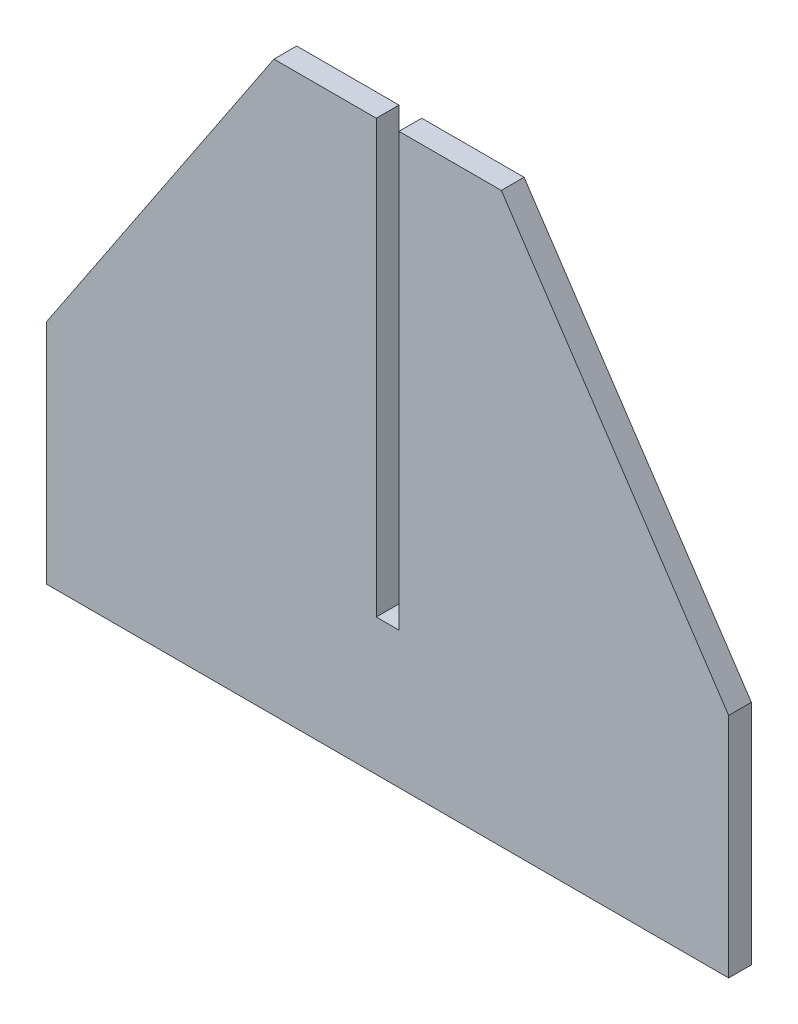
ISO-10303-21;
HEADER;
FILE_DESCRIPTION(('STEP AP214'),'2;1');
FILE_NAME('part.step','',(''),(''),'','','');
FILE_SCHEMA(('AUTOMOTIVE_DESIGN { 1 0 10303 214 1 1 1 1 }'));
ENDSEC;
DATA;
#1=APPLICATION_CONTEXT('core data for automotive mechanical design processes');
#2=APPLICATION_PROTOCOL_DEFINITION('international standard','automotive_design',2000,#1);
#3=PRODUCT_CONTEXT('',#1,'mechanical');
#4=PRODUCT('Part','Part','',(#3));
#5=PRODUCT_RELATED_PRODUCT_CATEGORY('part','',(#4));
#6=PRODUCT_DEFINITION_FORMATION('','',#4);
#7=PRODUCT_DEFINITION_CONTEXT('part definition',#1,'design');
#8=PRODUCT_DEFINITION('design','',#6,#7);
#9=PRODUCT_DEFINITION_SHAPE('','',#8);
#10=(LENGTH_UNIT() NAMED_UNIT(*) SI_UNIT(.MILLI.,.METRE.));
#11=(NAMED_UNIT(*) PLANE_ANGLE_UNIT() SI_UNIT($,.RADIAN.));
#12=(NAMED_UNIT(*) SI_UNIT($,.STERADIAN.) SOLID_ANGLE_UNIT());
#13=UNCERTAINTY_MEASURE_WITH_UNIT(LENGTH_MEASURE(1.E-05),#10,'distance_accuracy_value','');
#14=(GEOMETRIC_REPRESENTATION_CONTEXT(3) GLOBAL_UNCERTAINTY_ASSIGNED_CONTEXT((#13)) GLOBAL_UNIT_ASSIGNED_CONTEXT((#10,
#11,#12)) REPRESENTATION_CONTEXT('',''));
#15=CARTESIAN_POINT('',(0.,0.,0.));
#16=DIRECTION('',(0.,0.,1.));
#17=DIRECTION('',(1.,0.,0.));
#18=AXIS2_PLACEMENT_3D('',#15,#16,#17);
#19=CARTESIAN_POINT('',(-4.99999999999998,135.,10.));
#20=DIRECTION('',(-1.,0.,0.));
#21=DIRECTION('',(0.,-1.,0.));
#22=AXIS2_PLACEMENT_3D('',#19,#20,#21);
#23=PLANE('',#22);
#24=DIRECTION('',(0.,1.,0.));
#25=VECTOR('',#24,1.);
#26=CARTESIAN_POINT('',(-4.99999999999998,135.,0.));
#27=LINE('',#26,#25);
#28=CARTESIAN_POINT('',(-5.00000000000001,-55.,0.));
#29=VERTEX_POINT('',#28);
#30=CARTESIAN_POINT('',(-4.99999999999998,135.,0.));
#31=VERTEX_POINT('',#30);
#32=EDGE_CURVE('E140',#29,#31,#27,.T.);
#33=ORIENTED_EDGE('',*,*,#32,.T.);
#34=DIRECTION('',(0.,0.,-1.));
#35=VECTOR('',#34,1.);
#36=CARTESIAN_POINT('',(-4.99999999999998,135.,10.));
#37=LINE('',#36,#35);
#38=CARTESIAN_POINT('',(-4.99999999999998,135.,10.));
#39=VERTEX_POINT('',#38);
#40=EDGE_CURVE('E11',#39,#31,#37,.T.);
#41=ORIENTED_EDGE('',*,*,#40,.F.);
#42=DIRECTION('',(0.,1.,0.));
#43=VECTOR('',#42,1.);
#44=CARTESIAN_POINT('',(-4.99999999999998,135.,10.));
#45=LINE('',#44,#43);
#46=CARTESIAN_POINT('',(-5.00000000000001,-55.,10.));
#47=VERTEX_POINT('',#46);
#48=EDGE_CURVE('E158',#47,#39,#45,.T.);
#49=ORIENTED_EDGE('',*,*,#48,.F.);
#50=DIRECTION('',(0.,0.,-1.));
#51=VECTOR('',#50,1.);
#52=CARTESIAN_POINT('',(-5.00000000000001,-55.,10.));
#53=LINE('',#52,#51);
#54=EDGE_CURVE('E136',#47,#29,#53,.T.);
#55=ORIENTED_EDGE('',*,*,#54,.T.);
#56=EDGE_LOOP('',(#33,#41,#49,#55));
#57=FACE_BOUND('',#56,.T.);
#58=ADVANCED_FACE('F32',(#57),#23,.F.);
#59=CARTESIAN_POINT('',(-50.,135.,10.));
#60=DIRECTION('',(0.,-1.,0.));
#61=DIRECTION('',(0.,0.,-1.));
#62=AXIS2_PLACEMENT_3D('',#59,#60,#61);
#63=PLANE('',#62);
#64=DIRECTION('',(-1.,0.,0.));
#65=VECTOR('',#64,1.);
#66=CARTESIAN_POINT('',(-50.,135.,0.));
#67=LINE('',#66,#65);
#68=CARTESIAN_POINT('',(-50.,135.,0.));
#69=VERTEX_POINT('',#68);
#70=EDGE_CURVE('E143',#31,#69,#67,.T.);
#71=ORIENTED_EDGE('',*,*,#70,.T.);
#72=DIRECTION('',(0.,0.,-1.));
#73=VECTOR('',#72,1.);
#74=CARTESIAN_POINT('',(-50.,135.,10.));
#75=LINE('',#74,#73);
#76=CARTESIAN_POINT('',(-50.,135.,10.));
#77=VERTEX_POINT('',#76);
#78=EDGE_CURVE('E40',#77,#69,#75,.T.);
#79=ORIENTED_EDGE('',*,*,#78,.F.);
#80=DIRECTION('',(-1.,0.,0.));
#81=VECTOR('',#80,1.);
#82=CARTESIAN_POINT('',(-50.,135.,10.));
#83=LINE('',#82,#81);
#84=EDGE_CURVE('E97',#39,#77,#83,.T.);
#85=ORIENTED_EDGE('',*,*,#84,.F.);
#86=ORIENTED_EDGE('',*,*,#40,.T.);
#87=EDGE_LOOP('',(#71,#79,#85,#86));
#88=FACE_BOUND('',#87,.T.);
#89=ADVANCED_FACE('F207',(#88),#63,.F.);
#90=CARTESIAN_POINT('',(-150.,-15.,10.));
#91=DIRECTION('',(0.832050294337844,-0.554700196225229,0.));
#92=DIRECTION('',(0.554700196225229,0.832050294337844,0.));
#93=AXIS2_PLACEMENT_3D('',#90,#91,#92);
#94=PLANE('',#93);
#95=DIRECTION('',(-0.554700196225229,-0.832050294337844,0.));
#96=VECTOR('',#95,1.);
#97=CARTESIAN_POINT('',(-150.,-15.,0.));
#98=LINE('',#97,#96);
#99=CARTESIAN_POINT('',(-150.,-15.,0.));
#100=VERTEX_POINT('',#99);
#101=EDGE_CURVE('E145',#69,#100,#98,.T.);
#102=ORIENTED_EDGE('',*,*,#101,.T.);
#103=DIRECTION('',(0.,0.,-1.));
#104=VECTOR('',#103,1.);
#105=CARTESIAN_POINT('',(-150.,-15.,10.));
#106=LINE('',#105,#104);
#107=CARTESIAN_POINT('',(-150.,-15.,10.));
#108=VERTEX_POINT('',#107);
#109=EDGE_CURVE('E171',#108,#100,#106,.T.);
#110=ORIENTED_EDGE('',*,*,#109,.F.);
#111=DIRECTION('',(-0.554700196225229,-0.832050294337844,0.));
#112=VECTOR('',#111,1.);
#113=CARTESIAN_POINT('',(-150.,-15.,10.));
#114=LINE('',#113,#112);
#115=EDGE_CURVE('E179',#77,#108,#114,.T.);
#116=ORIENTED_EDGE('',*,*,#115,.F.);
#117=ORIENTED_EDGE('',*,*,#78,.T.);
#118=EDGE_LOOP('',(#102,#110,#116,#117));
#119=FACE_BOUND('',#118,.T.);
#120=ADVANCED_FACE('F177',(#119),#94,.F.);
#121=CARTESIAN_POINT('',(-150.,-115.,10.));
#122=DIRECTION('',(1.,0.,0.));
#123=DIRECTION('',(0.,1.,0.));
#124=AXIS2_PLACEMENT_3D('',#121,#122,#123);
#125=PLANE('',#124);
#126=DIRECTION('',(0.,-1.,0.));
#127=VECTOR('',#126,1.);
#128=CARTESIAN_POINT('',(-150.,-115.,0.));
#129=LINE('',#128,#127);
#130=CARTESIAN_POINT('',(-150.,-115.,0.));
#131=VERTEX_POINT('',#130);
#132=EDGE_CURVE('E147',#100,#131,#129,.T.);
#133=ORIENTED_EDGE('',*,*,#132,.T.);
#134=DIRECTION('',(0.,0.,-1.));
#135=VECTOR('',#134,1.);
#136=CARTESIAN_POINT('',(-150.,-115.,10.));
#137=LINE('',#136,#135);
#138=CARTESIAN_POINT('',(-150.,-115.,10.));
#139=VERTEX_POINT('',#138);
#140=EDGE_CURVE('E168',#139,#131,#137,.T.);
#141=ORIENTED_EDGE('',*,*,#140,.F.);
#142=DIRECTION('',(0.,-1.,0.));
#143=VECTOR('',#142,1.);
#144=CARTESIAN_POINT('',(-150.,-115.,10.));
#145=LINE('',#144,#143);
#146=EDGE_CURVE('E197',#108,#139,#145,.T.);
#147=ORIENTED_EDGE('',*,*,#146,.F.);
#148=ORIENTED_EDGE('',*,*,#109,.T.);
#149=EDGE_LOOP('',(#133,#141,#147,#148));
#150=FACE_BOUND('',#149,.T.);
#151=ADVANCED_FACE('F188',(#150),#125,.F.);
#152=CARTESIAN_POINT('',(150.,-115.,10.));
#153=DIRECTION('',(0.,1.,0.));
#154=DIRECTION('',(0.,0.,1.));
#155=AXIS2_PLACEMENT_3D('',#152,#153,#154);
#156=PLANE('',#155);
#157=DIRECTION('',(1.,0.,0.));
#158=VECTOR('',#157,1.);
#159=CARTESIAN_POINT('',(150.,-115.,0.));
#160=LINE('',#159,#158);
#161=CARTESIAN_POINT('',(150.,-115.,0.));
#162=VERTEX_POINT('',#161);
#163=EDGE_CURVE('E149',#131,#162,#160,.T.);
#164=ORIENTED_EDGE('',*,*,#163,.T.);
#165=DIRECTION('',(0.,0.,-1.));
#166=VECTOR('',#165,1.);
#167=CARTESIAN_POINT('',(150.,-115.,10.));
#168=LINE('',#167,#166);
#169=CARTESIAN_POINT('',(150.,-115.,10.));
#170=VERTEX_POINT('',#169);
#171=EDGE_CURVE('E165',#170,#162,#168,.T.);
#172=ORIENTED_EDGE('',*,*,#171,.F.);
#173=DIRECTION('',(1.,0.,0.));
#174=VECTOR('',#173,1.);
#175=CARTESIAN_POINT('',(150.,-115.,10.));
#176=LINE('',#175,#174);
#177=EDGE_CURVE('E194',#139,#170,#176,.T.);
#178=ORIENTED_EDGE('',*,*,#177,.F.);
#179=ORIENTED_EDGE('',*,*,#140,.T.);
#180=EDGE_LOOP('',(#164,#172,#178,#179));
#181=FACE_BOUND('',#180,.T.);
#182=ADVANCED_FACE('F192',(#181),#156,.F.);
#183=CARTESIAN_POINT('',(150.,-115.,10.));
#184=DIRECTION('',(-1.,0.,0.));
#185=DIRECTION('',(0.,-1.,0.));
#186=AXIS2_PLACEMENT_3D('',#183,#184,#185);
#187=PLANE('',#186);
#188=DIRECTION('',(0.,1.,0.));
#189=VECTOR('',#188,1.);
#190=CARTESIAN_POINT('',(150.,-115.,0.));
#191=LINE('',#190,#189);
#192=CARTESIAN_POINT('',(150.,-15.,0.));
#193=VERTEX_POINT('',#192);
#194=EDGE_CURVE('E151',#162,#193,#191,.T.);
#195=ORIENTED_EDGE('',*,*,#194,.T.);
#196=DIRECTION('',(0.,0.,-1.));
#197=VECTOR('',#196,1.);
#198=CARTESIAN_POINT('',(150.,-15.,10.));
#199=LINE('',#198,#197);
#200=CARTESIAN_POINT('',(150.,-15.,10.));
#201=VERTEX_POINT('',#200);
#202=EDGE_CURVE('E162',#201,#193,#199,.T.);
#203=ORIENTED_EDGE('',*,*,#202,.F.);
#204=DIRECTION('',(0.,1.,0.));
#205=VECTOR('',#204,1.);
#206=CARTESIAN_POINT('',(150.,-115.,10.));
#207=LINE('',#206,#205);
#208=EDGE_CURVE('E196',#170,#201,#207,.T.);
#209=ORIENTED_EDGE('',*,*,#208,.F.);
#210=ORIENTED_EDGE('',*,*,#171,.T.);
#211=EDGE_LOOP('',(#195,#203,#209,#210));
#212=FACE_BOUND('',#211,.T.);
#213=ADVANCED_FACE('F219',(#212),#187,.F.);
#214=CARTESIAN_POINT('',(150.,-15.,10.));
#215=DIRECTION('',(-0.832050294337844,-0.554700196225229,0.));
#216=DIRECTION('',(0.554700196225229,-0.832050294337844,0.));
#217=AXIS2_PLACEMENT_3D('',#214,#215,#216);
#218=PLANE('',#217);
#219=DIRECTION('',(-0.554700196225229,0.832050294337844,0.));
#220=VECTOR('',#219,1.);
#221=CARTESIAN_POINT('',(150.,-15.,0.));
#222=LINE('',#221,#220);
#223=CARTESIAN_POINT('',(50.,135.,0.));
#224=VERTEX_POINT('',#223);
#225=EDGE_CURVE('E153',#193,#224,#222,.T.);
#226=ORIENTED_EDGE('',*,*,#225,.T.);
#227=DIRECTION('',(0.,0.,-1.));
#228=VECTOR('',#227,1.);
#229=CARTESIAN_POINT('',(50.,135.,10.));
#230=LINE('',#229,#228);
#231=CARTESIAN_POINT('',(50.,135.,10.));
#232=VERTEX_POINT('',#231);
#233=EDGE_CURVE('E131',#232,#224,#230,.T.);
#234=ORIENTED_EDGE('',*,*,#233,.F.);
#235=DIRECTION('',(-0.554700196225229,0.832050294337844,0.));
#236=VECTOR('',#235,1.);
#237=CARTESIAN_POINT('',(150.,-15.,10.));
#238=LINE('',#237,#236);
#239=EDGE_CURVE('E122',#201,#232,#238,.T.);
#240=ORIENTED_EDGE('',*,*,#239,.F.);
#241=ORIENTED_EDGE('',*,*,#202,.T.);
#242=EDGE_LOOP('',(#226,#234,#240,#241));
#243=FACE_BOUND('',#242,.T.);
#244=ADVANCED_FACE('F222',(#243),#218,.F.);
#245=CARTESIAN_POINT('',(50.,135.,10.));
#246=DIRECTION('',(0.,-1.,0.));
#247=DIRECTION('',(0.,0.,-1.));
#248=AXIS2_PLACEMENT_3D('',#245,#246,#247);
#249=PLANE('',#248);
#250=DIRECTION('',(-1.,0.,0.));
#251=VECTOR('',#250,1.);
#252=CARTESIAN_POINT('',(50.,135.,0.));
#253=LINE('',#252,#251);
#254=CARTESIAN_POINT('',(4.99999999999998,135.,0.));
#255=VERTEX_POINT('',#254);
#256=EDGE_CURVE('E130',#224,#255,#253,.T.);
#257=ORIENTED_EDGE('',*,*,#256,.T.);
#258=DIRECTION('',(0.,0.,-1.));
#259=VECTOR('',#258,1.);
#260=CARTESIAN_POINT('',(4.99999999999998,135.,10.));
#261=LINE('',#260,#259);
#262=CARTESIAN_POINT('',(4.99999999999998,135.,10.));
#263=VERTEX_POINT('',#262);
#264=EDGE_CURVE('E127',#263,#255,#261,.T.);
#265=ORIENTED_EDGE('',*,*,#264,.F.);
#266=DIRECTION('',(-1.,0.,0.));
#267=VECTOR('',#266,1.);
#268=CARTESIAN_POINT('',(50.,135.,10.));
#269=LINE('',#268,#267);
#270=EDGE_CURVE('E116',#232,#263,#269,.T.);
#271=ORIENTED_EDGE('',*,*,#270,.F.);
#272=ORIENTED_EDGE('',*,*,#233,.T.);
#273=EDGE_LOOP('',(#257,#265,#271,#272));
#274=FACE_BOUND('',#273,.T.);
#275=ADVANCED_FACE('F128',(#274),#249,.F.);
#276=CARTESIAN_POINT('',(4.99999999999998,135.,10.));
#277=DIRECTION('',(1.,0.,0.));
#278=DIRECTION('',(0.,1.,0.));
#279=AXIS2_PLACEMENT_3D('',#276,#277,#278);
#280=PLANE('',#279);
#281=DIRECTION('',(0.,-1.,0.));
#282=VECTOR('',#281,1.);
#283=CARTESIAN_POINT('',(4.99999999999998,135.,0.));
#284=LINE('',#283,#282);
#285=CARTESIAN_POINT('',(5.00000000000001,-55.,0.));
#286=VERTEX_POINT('',#285);
#287=EDGE_CURVE('E83',#255,#286,#284,.T.);
#288=ORIENTED_EDGE('',*,*,#287,.T.);
#289=DIRECTION('',(0.,0.,-1.));
#290=VECTOR('',#289,1.);
#291=CARTESIAN_POINT('',(5.00000000000001,-55.,10.));
#292=LINE('',#291,#290);
#293=CARTESIAN_POINT('',(5.00000000000001,-55.,10.));
#294=VERTEX_POINT('',#293);
#295=EDGE_CURVE('E132',#294,#286,#292,.T.);
#296=ORIENTED_EDGE('',*,*,#295,.F.);
#297=DIRECTION('',(0.,-1.,0.));
#298=VECTOR('',#297,1.);
#299=CARTESIAN_POINT('',(4.99999999999998,135.,10.));
#300=LINE('',#299,#298);
#301=EDGE_CURVE('E120',#263,#294,#300,.T.);
#302=ORIENTED_EDGE('',*,*,#301,.F.);
#303=ORIENTED_EDGE('',*,*,#264,.T.);
#304=EDGE_LOOP('',(#288,#296,#302,#303));
#305=FACE_BOUND('',#304,.T.);
#306=ADVANCED_FACE('F134',(#305),#280,.F.);
#307=CARTESIAN_POINT('',(5.00000000000001,-55.,10.));
#308=DIRECTION('',(0.,-1.,0.));
#309=DIRECTION('',(0.,0.,-1.));
#310=AXIS2_PLACEMENT_3D('',#307,#308,#309);
#311=PLANE('',#310);
#312=DIRECTION('',(-1.,0.,0.));
#313=VECTOR('',#312,1.);
#314=CARTESIAN_POINT('',(5.00000000000001,-55.,0.));
#315=LINE('',#314,#313);
#316=EDGE_CURVE('E89',#286,#29,#315,.T.);
#317=ORIENTED_EDGE('',*,*,#316,.T.);
#318=ORIENTED_EDGE('',*,*,#54,.F.);
#319=DIRECTION('',(-1.,0.,0.));
#320=VECTOR('',#319,1.);
#321=CARTESIAN_POINT('',(5.00000000000001,-55.,10.));
#322=LINE('',#321,#320);
#323=EDGE_CURVE('E48',#294,#47,#322,.T.);
#324=ORIENTED_EDGE('',*,*,#323,.F.);
#325=ORIENTED_EDGE('',*,*,#295,.T.);
#326=EDGE_LOOP('',(#317,#318,#324,#325));
#327=FACE_BOUND('',#326,.T.);
#328=ADVANCED_FACE('F231',(#327),#311,.F.);
#329=CARTESIAN_POINT('',(0.,0.,10.));
#330=DIRECTION('',(0.,0.,-1.));
#331=DIRECTION('',(-1.,0.,0.));
#332=AXIS2_PLACEMENT_3D('',#329,#330,#331);
#333=PLANE('',#332);
#334=ORIENTED_EDGE('',*,*,#48,.T.);
#335=ORIENTED_EDGE('',*,*,#84,.T.);
#336=ORIENTED_EDGE('',*,*,#115,.T.);
#337=ORIENTED_EDGE('',*,*,#146,.T.);
#338=ORIENTED_EDGE('',*,*,#177,.T.);
#339=ORIENTED_EDGE('',*,*,#208,.T.);
#340=ORIENTED_EDGE('',*,*,#239,.T.);
#341=ORIENTED_EDGE('',*,*,#270,.T.);
#342=ORIENTED_EDGE('',*,*,#301,.T.);
#343=ORIENTED_EDGE('',*,*,#323,.T.);
#344=EDGE_LOOP('',(#334,#335,#336,#337,#338,#339,#340,#341,#342,#343));
#345=FACE_BOUND('',#344,.T.);
#346=ADVANCED_FACE('F118',(#345),#333,.F.);
#347=CARTESIAN_POINT('',(0.,0.,0.));
#348=DIRECTION('',(0.,0.,-1.));
#349=DIRECTION('',(-1.,0.,0.));
#350=AXIS2_PLACEMENT_3D('',#347,#348,#349);
#351=PLANE('',#350);
#352=ORIENTED_EDGE('',*,*,#32,.F.);
#353=ORIENTED_EDGE('',*,*,#316,.F.);
#354=ORIENTED_EDGE('',*,*,#287,.F.);
#355=ORIENTED_EDGE('',*,*,#256,.F.);
#356=ORIENTED_EDGE('',*,*,#225,.F.);
#357=ORIENTED_EDGE('',*,*,#194,.F.);
#358=ORIENTED_EDGE('',*,*,#163,.F.);
#359=ORIENTED_EDGE('',*,*,#132,.F.);
#360=ORIENTED_EDGE('',*,*,#101,.F.);
#361=ORIENTED_EDGE('',*,*,#70,.F.);
#362=EDGE_LOOP('',(#352,#353,#354,#355,#356,#357,#358,#359,#360,#361));
#363=FACE_BOUND('',#362,.T.);
#364=ADVANCED_FACE('F183',(#363),#351,.T.);
#365=CLOSED_SHELL('',(#58,#89,#120,#151,#182,#213,#244,#275,#306,#328,#346,#364));
#366=MANIFOLD_SOLID_BREP('B2',#365);
#367=ADVANCED_BREP_SHAPE_REPRESENTATION('',(#18,#366),#14);
#368=SHAPE_DEFINITION_REPRESENTATION(#9,#367);
ENDSEC;
END-ISO-10303-21;
